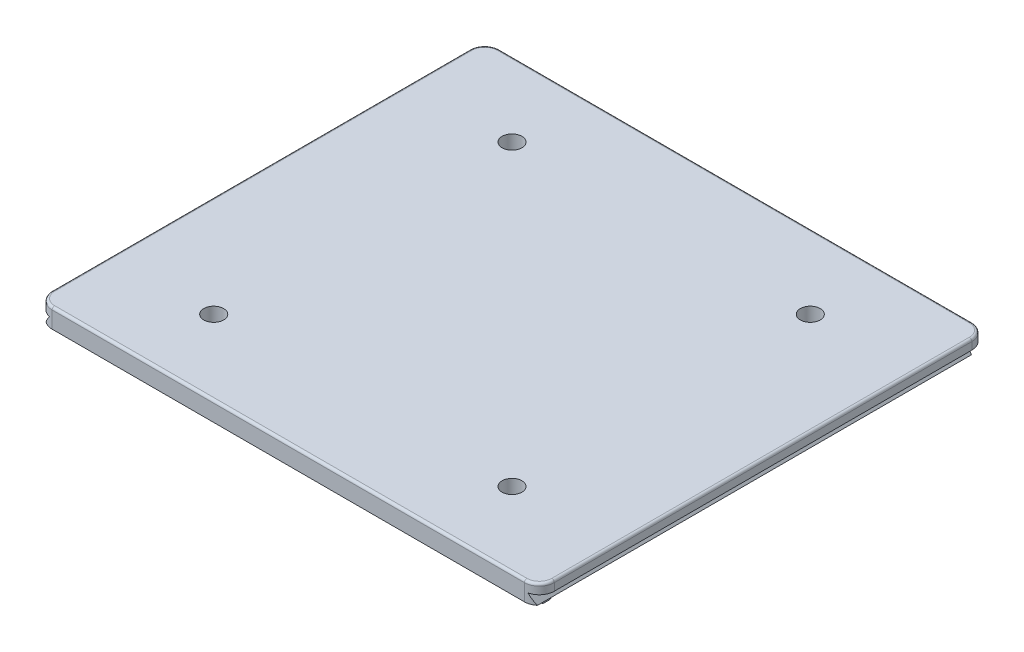
ISO-10303-21;
HEADER;
FILE_DESCRIPTION(('STEP AP214'),'2;1');
FILE_NAME('part.step','',(''),(''),'','','');
FILE_SCHEMA(('AUTOMOTIVE_DESIGN { 1 0 10303 214 1 1 1 1 }'));
ENDSEC;
DATA;
#1=APPLICATION_CONTEXT('core data for automotive mechanical design processes');
#2=APPLICATION_PROTOCOL_DEFINITION('international standard','automotive_design',2000,#1);
#3=PRODUCT_CONTEXT('',#1,'mechanical');
#4=PRODUCT('Part','Part','',(#3));
#5=PRODUCT_RELATED_PRODUCT_CATEGORY('part','',(#4));
#6=PRODUCT_DEFINITION_FORMATION('','',#4);
#7=PRODUCT_DEFINITION_CONTEXT('part definition',#1,'design');
#8=PRODUCT_DEFINITION('design','',#6,#7);
#9=PRODUCT_DEFINITION_SHAPE('','',#8);
#10=(LENGTH_UNIT() NAMED_UNIT(*) SI_UNIT(.MILLI.,.METRE.));
#11=(NAMED_UNIT(*) PLANE_ANGLE_UNIT() SI_UNIT($,.RADIAN.));
#12=(NAMED_UNIT(*) SI_UNIT($,.STERADIAN.) SOLID_ANGLE_UNIT());
#13=UNCERTAINTY_MEASURE_WITH_UNIT(LENGTH_MEASURE(1.E-05),#10,'distance_accuracy_value','');
#14=(GEOMETRIC_REPRESENTATION_CONTEXT(3) GLOBAL_UNCERTAINTY_ASSIGNED_CONTEXT((#13)) GLOBAL_UNIT_ASSIGNED_CONTEXT((#10,
#11,#12)) REPRESENTATION_CONTEXT('',''));
#15=CARTESIAN_POINT('',(0.,0.,0.));
#16=DIRECTION('',(0.,0.,1.));
#17=DIRECTION('',(1.,0.,0.));
#18=AXIS2_PLACEMENT_3D('',#15,#16,#17);
#19=CARTESIAN_POINT('',(0.,24.25,-189.073352076598));
#20=DIRECTION('',(0.,1.,0.));
#21=DIRECTION('',(-1.,0.,0.));
#22=AXIS2_PLACEMENT_3D('',#19,#20,#21);
#23=PLANE('',#22);
#24=CARTESIAN_POINT('',(-60.,24.25,-75.));
#25=DIRECTION('',(0.,1.,0.));
#26=DIRECTION('',(-1.,0.,0.));
#27=AXIS2_PLACEMENT_3D('',#24,#25,#26);
#28=CIRCLE('',#27,2.);
#29=CARTESIAN_POINT('',(-62.,24.25,-75.));
#30=VERTEX_POINT('',#29);
#31=EDGE_CURVE('E355',#30,#30,#28,.F.);
#32=ORIENTED_EDGE('',*,*,#31,.F.);
#33=EDGE_LOOP('',(#32));
#34=FACE_BOUND('',#33,.T.);
#35=CARTESIAN_POINT('',(-60.,24.25,-15.));
#36=DIRECTION('',(0.,1.,0.));
#37=DIRECTION('',(-1.,0.,0.));
#38=AXIS2_PLACEMENT_3D('',#35,#36,#37);
#39=CIRCLE('',#38,2.);
#40=CARTESIAN_POINT('',(-62.,24.25,-15.));
#41=VERTEX_POINT('',#40);
#42=EDGE_CURVE('E366',#41,#41,#39,.F.);
#43=ORIENTED_EDGE('',*,*,#42,.F.);
#44=EDGE_LOOP('',(#43));
#45=FACE_BOUND('',#44,.T.);
#46=CARTESIAN_POINT('',(0.,24.25,-15.));
#47=DIRECTION('',(0.,1.,0.));
#48=DIRECTION('',(-1.,0.,0.));
#49=AXIS2_PLACEMENT_3D('',#46,#47,#48);
#50=CIRCLE('',#49,2.);
#51=CARTESIAN_POINT('',(-2.,24.25,-15.));
#52=VERTEX_POINT('',#51);
#53=EDGE_CURVE('E879',#52,#52,#50,.F.);
#54=ORIENTED_EDGE('',*,*,#53,.F.);
#55=EDGE_LOOP('',(#54));
#56=FACE_BOUND('',#55,.T.);
#57=CARTESIAN_POINT('',(0.,24.25,-75.));
#58=DIRECTION('',(0.,1.,0.));
#59=DIRECTION('',(-1.,0.,0.));
#60=AXIS2_PLACEMENT_3D('',#57,#58,#59);
#61=CIRCLE('',#60,2.);
#62=CARTESIAN_POINT('',(-2.,24.25,-75.));
#63=VERTEX_POINT('',#62);
#64=EDGE_CURVE('E223',#63,#63,#61,.F.);
#65=ORIENTED_EDGE('',*,*,#64,.F.);
#66=EDGE_LOOP('',(#65));
#67=FACE_BOUND('',#66,.T.);
#68=DIRECTION('',(1.,0.,0.));
#69=VECTOR('',#68,1.);
#70=CARTESIAN_POINT('',(19.4201695446766,24.25,-3.49999999999999));
#71=LINE('',#70,#69);
#72=CARTESIAN_POINT('',(-79.4201695446767,24.25,-3.49999999999998));
#73=VERTEX_POINT('',#72);
#74=CARTESIAN_POINT('',(19.4201695446766,24.25,-3.49999999999998));
#75=VERTEX_POINT('',#74);
#76=EDGE_CURVE('E205',#73,#75,#71,.T.);
#77=ORIENTED_EDGE('',*,*,#76,.F.);
#78=DIRECTION('',(0.,0.,1.));
#79=VECTOR('',#78,1.);
#80=CARTESIAN_POINT('',(-79.4201695446767,24.25,-189.073352076598));
#81=LINE('',#80,#79);
#82=CARTESIAN_POINT('',(-79.4201695446767,24.25,-88.));
#83=VERTEX_POINT('',#82);
#84=EDGE_CURVE('E204',#83,#73,#81,.T.);
#85=ORIENTED_EDGE('',*,*,#84,.F.);
#86=DIRECTION('',(1.,0.,0.));
#87=VECTOR('',#86,1.);
#88=CARTESIAN_POINT('',(0.,24.25,-88.));
#89=LINE('',#88,#87);
#90=CARTESIAN_POINT('',(19.4201695446766,24.25,-88.));
#91=VERTEX_POINT('',#90);
#92=EDGE_CURVE('E241',#83,#91,#89,.T.);
#93=ORIENTED_EDGE('',*,*,#92,.T.);
#94=DIRECTION('',(0.,0.,1.));
#95=VECTOR('',#94,1.);
#96=CARTESIAN_POINT('',(19.4201695446766,24.25,-189.073352076598));
#97=LINE('',#96,#95);
#98=EDGE_CURVE('E254',#91,#75,#97,.T.);
#99=ORIENTED_EDGE('',*,*,#98,.T.);
#100=EDGE_LOOP('',(#77,#85,#93,#99));
#101=FACE_BOUND('',#100,.T.);
#102=ADVANCED_FACE('F43',(#34,#45,#56,#67,#101),#23,.F.);
#103=CARTESIAN_POINT('',(19.4201695446766,24.25,-1.49999999999997));
#104=VERTEX_POINT('',#103);
#105=CARTESIAN_POINT('',(19.4201695446766,24.25,-0.695016503378748));
#106=VERTEX_POINT('',#105);
#107=EDGE_CURVE('E256',#104,#106,#97,.T.);
#108=ORIENTED_EDGE('',*,*,#107,.T.);
#109=CARTESIAN_POINT('',(17.5,24.25,-3.));
#110=DIRECTION('',(0.,1.,0.));
#111=DIRECTION('',(-1.,0.,0.));
#112=AXIS2_PLACEMENT_3D('',#109,#110,#111);
#113=CIRCLE('',#112,3.);
#114=CARTESIAN_POINT('',(17.5,24.25,0.));
#115=VERTEX_POINT('',#114);
#116=EDGE_CURVE('E289',#106,#115,#113,.F.);
#117=ORIENTED_EDGE('',*,*,#116,.T.);
#118=DIRECTION('',(-1.,0.,0.));
#119=VECTOR('',#118,1.);
#120=CARTESIAN_POINT('',(0.,24.25,0.));
#121=LINE('',#120,#119);
#122=CARTESIAN_POINT('',(-77.5,24.25,0.));
#123=VERTEX_POINT('',#122);
#124=EDGE_CURVE('E238',#115,#123,#121,.T.);
#125=ORIENTED_EDGE('',*,*,#124,.T.);
#126=CARTESIAN_POINT('',(-77.5,24.25,-3.));
#127=DIRECTION('',(0.,1.,0.));
#128=DIRECTION('',(-1.,0.,0.));
#129=AXIS2_PLACEMENT_3D('',#126,#127,#128);
#130=CIRCLE('',#129,3.);
#131=CARTESIAN_POINT('',(-79.4201695446767,24.25,-0.695016503378748));
#132=VERTEX_POINT('',#131);
#133=EDGE_CURVE('E214',#123,#132,#130,.F.);
#134=ORIENTED_EDGE('',*,*,#133,.T.);
#135=CARTESIAN_POINT('',(-79.4201695446767,24.25,-1.49999999999998));
#136=VERTEX_POINT('',#135);
#137=EDGE_CURVE('E200',#136,#132,#81,.T.);
#138=ORIENTED_EDGE('',*,*,#137,.F.);
#139=DIRECTION('',(-1.,0.,0.));
#140=VECTOR('',#139,1.);
#141=CARTESIAN_POINT('',(19.4201695446766,24.25,-1.49999999999998));
#142=LINE('',#141,#140);
#143=EDGE_CURVE('E206',#104,#136,#142,.T.);
#144=ORIENTED_EDGE('',*,*,#143,.F.);
#145=EDGE_LOOP('',(#108,#117,#125,#134,#138,#144));
#146=FACE_BOUND('',#145,.T.);
#147=ADVANCED_FACE('F210',(#146),#23,.F.);
#148=CARTESIAN_POINT('',(18.5,26.,-88.));
#149=DIRECTION('',(0.,0.,1.));
#150=DIRECTION('',(1.,0.,0.));
#151=AXIS2_PLACEMENT_3D('',#148,#149,#150);
#152=PLANE('',#151);
#153=DIRECTION('',(-1.,0.,0.));
#154=VECTOR('',#153,1.);
#155=CARTESIAN_POINT('',(-80.5,26.1,-88.));
#156=LINE('',#155,#154);
#157=CARTESIAN_POINT('',(18.1247855989887,26.1,-88.));
#158=VERTEX_POINT('',#157);
#159=CARTESIAN_POINT('',(-78.1247855989887,26.1,-88.));
#160=VERTEX_POINT('',#159);
#161=EDGE_CURVE('E230',#158,#160,#156,.T.);
#162=ORIENTED_EDGE('',*,*,#161,.F.);
#163=DIRECTION('',(-0.573576436351041,0.819152044288995,0.));
#164=VECTOR('',#163,1.);
#165=CARTESIAN_POINT('',(24.4249023849071,17.102500769948,-88.));
#166=LINE('',#165,#164);
#167=EDGE_CURVE('E234',#91,#158,#166,.T.);
#168=ORIENTED_EDGE('',*,*,#167,.F.);
#169=ORIENTED_EDGE('',*,*,#92,.F.);
#170=DIRECTION('',(-0.57357643635105,-0.819152044288989,0.));
#171=VECTOR('',#170,1.);
#172=CARTESIAN_POINT('',(-64.6855066846768,45.2932793935257,-88.));
#173=LINE('',#172,#171);
#174=EDGE_CURVE('E239',#160,#83,#173,.T.);
#175=ORIENTED_EDGE('',*,*,#174,.F.);
#176=EDGE_LOOP('',(#162,#168,#169,#175));
#177=FACE_BOUND('',#176,.T.);
#178=ADVANCED_FACE('F393',(#177),#152,.F.);
#179=CARTESIAN_POINT('',(20.5,0.,-189.073352076598));
#180=DIRECTION('',(1.,0.,0.));
#181=DIRECTION('',(0.,0.,-1.));
#182=AXIS2_PLACEMENT_3D('',#179,#180,#181);
#183=PLANE('',#182);
#184=DIRECTION('',(0.,1.,0.));
#185=VECTOR('',#184,1.);
#186=CARTESIAN_POINT('',(20.5,28.1,-87.));
#187=LINE('',#186,#185);
#188=CARTESIAN_POINT('',(20.5,26.1,-87.));
#189=VERTEX_POINT('',#188);
#190=CARTESIAN_POINT('',(20.5,27.6,-87.));
#191=VERTEX_POINT('',#190);
#192=EDGE_CURVE('E273',#189,#191,#187,.T.);
#193=ORIENTED_EDGE('',*,*,#192,.T.);
#194=DIRECTION('',(0.,0.,1.));
#195=VECTOR('',#194,1.);
#196=CARTESIAN_POINT('',(20.5,27.6,-189.073352076598));
#197=LINE('',#196,#195);
#198=CARTESIAN_POINT('',(20.5,27.6,-3.));
#199=VERTEX_POINT('',#198);
#200=EDGE_CURVE('E322',#191,#199,#197,.T.);
#201=ORIENTED_EDGE('',*,*,#200,.T.);
#202=DIRECTION('',(0.,1.,0.));
#203=VECTOR('',#202,1.);
#204=CARTESIAN_POINT('',(20.5,0.,-3.));
#205=LINE('',#204,#203);
#206=CARTESIAN_POINT('',(20.5,26.1,-3.));
#207=VERTEX_POINT('',#206);
#208=EDGE_CURVE('E276',#199,#207,#205,.F.);
#209=ORIENTED_EDGE('',*,*,#208,.T.);
#210=DIRECTION('',(0.,0.,1.));
#211=VECTOR('',#210,1.);
#212=CARTESIAN_POINT('',(20.5,26.1,-189.073352076598));
#213=LINE('',#212,#211);
#214=EDGE_CURVE('E242',#189,#207,#213,.T.);
#215=ORIENTED_EDGE('',*,*,#214,.F.);
#216=EDGE_LOOP('',(#193,#201,#209,#215));
#217=FACE_BOUND('',#216,.T.);
#218=ADVANCED_FACE('F447',(#217),#183,.T.);
#219=CARTESIAN_POINT('',(0.,26.1,-189.073352076598));
#220=DIRECTION('',(0.,-1.,0.));
#221=DIRECTION('',(0.,0.,-1.));
#222=AXIS2_PLACEMENT_3D('',#219,#220,#221);
#223=PLANE('',#222);
#224=ORIENTED_EDGE('',*,*,#214,.T.);
#225=CARTESIAN_POINT('',(17.5,26.1,-3.));
#226=DIRECTION('',(0.,-1.,0.));
#227=DIRECTION('',(0.,0.,-1.));
#228=AXIS2_PLACEMENT_3D('',#225,#226,#227);
#229=CIRCLE('',#228,3.);
#230=CARTESIAN_POINT('',(18.1247855989887,26.1,-0.0657806906612657));
#231=VERTEX_POINT('',#230);
#232=EDGE_CURVE('E284',#207,#231,#229,.T.);
#233=ORIENTED_EDGE('',*,*,#232,.T.);
#234=DIRECTION('',(0.,0.,1.));
#235=VECTOR('',#234,1.);
#236=CARTESIAN_POINT('',(18.1247855989887,26.1,-189.073352076598));
#237=LINE('',#236,#235);
#238=EDGE_CURVE('E251',#158,#231,#237,.T.);
#239=ORIENTED_EDGE('',*,*,#238,.F.);
#240=ORIENTED_EDGE('',*,*,#161,.T.);
#241=DIRECTION('',(0.,0.,1.));
#242=VECTOR('',#241,1.);
#243=CARTESIAN_POINT('',(-78.1247855989887,26.1,-189.073352076598));
#244=LINE('',#243,#242);
#245=CARTESIAN_POINT('',(-78.1247855989887,26.1,-0.0657806906612522));
#246=VERTEX_POINT('',#245);
#247=EDGE_CURVE('E215',#160,#246,#244,.T.);
#248=ORIENTED_EDGE('',*,*,#247,.T.);
#249=CARTESIAN_POINT('',(-77.5,26.1,-3.));
#250=DIRECTION('',(0.,-1.,0.));
#251=DIRECTION('',(0.,0.,-1.));
#252=AXIS2_PLACEMENT_3D('',#249,#250,#251);
#253=CIRCLE('',#252,3.);
#254=CARTESIAN_POINT('',(-80.5,26.1,-3.));
#255=VERTEX_POINT('',#254);
#256=EDGE_CURVE('E282',#246,#255,#253,.T.);
#257=ORIENTED_EDGE('',*,*,#256,.T.);
#258=DIRECTION('',(0.,0.,1.));
#259=VECTOR('',#258,1.);
#260=CARTESIAN_POINT('',(-80.5,26.1,-189.073352076598));
#261=LINE('',#260,#259);
#262=CARTESIAN_POINT('',(-80.5,26.1,-87.));
#263=VERTEX_POINT('',#262);
#264=EDGE_CURVE('E248',#263,#255,#261,.T.);
#265=ORIENTED_EDGE('',*,*,#264,.F.);
#266=CARTESIAN_POINT('',(-77.5,26.1,-87.));
#267=DIRECTION('',(0.,-1.,0.));
#268=DIRECTION('',(0.,0.,-1.));
#269=AXIS2_PLACEMENT_3D('',#266,#267,#268);
#270=CIRCLE('',#269,3.);
#271=CARTESIAN_POINT('',(-77.5,26.1,-90.));
#272=VERTEX_POINT('',#271);
#273=EDGE_CURVE('E278',#263,#272,#270,.T.);
#274=ORIENTED_EDGE('',*,*,#273,.T.);
#275=DIRECTION('',(1.,0.,0.));
#276=VECTOR('',#275,1.);
#277=CARTESIAN_POINT('',(-80.5,26.1,-90.));
#278=LINE('',#277,#276);
#279=CARTESIAN_POINT('',(17.5,26.1,-90.));
#280=VERTEX_POINT('',#279);
#281=EDGE_CURVE('E235',#272,#280,#278,.T.);
#282=ORIENTED_EDGE('',*,*,#281,.T.);
#283=CARTESIAN_POINT('',(17.5,26.1,-87.));
#284=DIRECTION('',(0.,-1.,0.));
#285=DIRECTION('',(0.,0.,-1.));
#286=AXIS2_PLACEMENT_3D('',#283,#284,#285);
#287=CIRCLE('',#286,3.);
#288=EDGE_CURVE('E280',#280,#189,#287,.T.);
#289=ORIENTED_EDGE('',*,*,#288,.T.);
#290=EDGE_LOOP('',(#224,#233,#239,#240,#248,#257,#265,#274,#282,#289));
#291=FACE_BOUND('',#290,.T.);
#292=ADVANCED_FACE('F398',(#291),#223,.T.);
#293=CARTESIAN_POINT('',(24.4249023849071,17.102500769948,-189.073352076598));
#294=DIRECTION('',(-0.819152044288995,-0.573576436351041,0.));
#295=DIRECTION('',(0.573576436351041,-0.819152044288995,0.));
#296=AXIS2_PLACEMENT_3D('',#293,#294,#295);
#297=PLANE('',#296);
#298=ORIENTED_EDGE('',*,*,#238,.T.);
#299=CARTESIAN_POINT('',(17.5,26.9922863078369,-3.));
#300=DIRECTION('',(-0.819152044288995,-0.573576436351041,0.));
#301=DIRECTION('',(-0.573576436351041,0.819152044288995,0.));
#302=AXIS2_PLACEMENT_3D('',#299,#300,#301);
#303=ELLIPSE('',#302,5.23034038686334,3.);
#304=EDGE_CURVE('E286',#231,#106,#303,.F.);
#305=ORIENTED_EDGE('',*,*,#304,.T.);
#306=ORIENTED_EDGE('',*,*,#107,.F.);
#307=DIRECTION('',(0.,0.,1.));
#308=VECTOR('',#307,1.);
#309=CARTESIAN_POINT('',(19.4201695446766,24.25,-1.49999999999998));
#310=LINE('',#309,#308);
#311=EDGE_CURVE('E220',#75,#104,#310,.T.);
#312=ORIENTED_EDGE('',*,*,#311,.F.);
#313=ORIENTED_EDGE('',*,*,#98,.F.);
#314=ORIENTED_EDGE('',*,*,#167,.T.);
#315=EDGE_LOOP('',(#298,#305,#306,#312,#313,#314));
#316=FACE_BOUND('',#315,.T.);
#317=ADVANCED_FACE('F390',(#316),#297,.F.);
#318=CARTESIAN_POINT('',(-64.6855066846768,45.2932793935257,-189.073352076598));
#319=DIRECTION('',(0.819152044288989,-0.57357643635105,0.));
#320=DIRECTION('',(0.57357643635105,0.819152044288989,0.));
#321=AXIS2_PLACEMENT_3D('',#318,#319,#320);
#322=PLANE('',#321);
#323=ORIENTED_EDGE('',*,*,#137,.T.);
#324=CARTESIAN_POINT('',(-77.5,26.9922863078368,-3.));
#325=DIRECTION('',(0.819152044288989,-0.57357643635105,0.));
#326=DIRECTION('',(-0.57357643635105,-0.819152044288989,0.));
#327=AXIS2_PLACEMENT_3D('',#324,#325,#326);
#328=ELLIPSE('',#327,5.23034038686331,3.);
#329=EDGE_CURVE('E295',#132,#246,#328,.F.);
#330=ORIENTED_EDGE('',*,*,#329,.T.);
#331=ORIENTED_EDGE('',*,*,#247,.F.);
#332=ORIENTED_EDGE('',*,*,#174,.T.);
#333=ORIENTED_EDGE('',*,*,#84,.T.);
#334=DIRECTION('',(0.,0.,-1.));
#335=VECTOR('',#334,1.);
#336=CARTESIAN_POINT('',(-79.4201695446767,24.25,-3.49999999999998));
#337=LINE('',#336,#335);
#338=EDGE_CURVE('E184',#136,#73,#337,.T.);
#339=ORIENTED_EDGE('',*,*,#338,.F.);
#340=EDGE_LOOP('',(#323,#330,#331,#332,#333,#339));
#341=FACE_BOUND('',#340,.T.);
#342=ADVANCED_FACE('F199',(#341),#322,.F.);
#343=CARTESIAN_POINT('',(-80.5000000000002,5.58580959264534E-13,-189.073352076598));
#344=DIRECTION('',(1.,0.,0.));
#345=DIRECTION('',(0.,1.,0.));
#346=AXIS2_PLACEMENT_3D('',#343,#344,#345);
#347=PLANE('',#346);
#348=DIRECTION('',(0.,1.,0.));
#349=VECTOR('',#348,1.);
#350=CARTESIAN_POINT('',(-80.5,28.1,-3.));
#351=LINE('',#350,#349);
#352=CARTESIAN_POINT('',(-80.5,27.6,-3.));
#353=VERTEX_POINT('',#352);
#354=EDGE_CURVE('E293',#255,#353,#351,.T.);
#355=ORIENTED_EDGE('',*,*,#354,.T.);
#356=DIRECTION('',(0.,0.,1.));
#357=VECTOR('',#356,1.);
#358=CARTESIAN_POINT('',(-80.5,27.6,-87.));
#359=LINE('',#358,#357);
#360=CARTESIAN_POINT('',(-80.5,27.6,-87.));
#361=VERTEX_POINT('',#360);
#362=EDGE_CURVE('E330',#353,#361,#359,.F.);
#363=ORIENTED_EDGE('',*,*,#362,.T.);
#364=DIRECTION('',(0.,-1.,0.));
#365=VECTOR('',#364,1.);
#366=CARTESIAN_POINT('',(-80.5000000000002,5.58580959264534E-13,-87.));
#367=LINE('',#366,#365);
#368=EDGE_CURVE('E291',#361,#263,#367,.T.);
#369=ORIENTED_EDGE('',*,*,#368,.T.);
#370=ORIENTED_EDGE('',*,*,#264,.T.);
#371=EDGE_LOOP('',(#355,#363,#369,#370));
#372=FACE_BOUND('',#371,.T.);
#373=ADVANCED_FACE('F426',(#372),#347,.F.);
#374=CARTESIAN_POINT('',(0.,28.1,-189.073352076598));
#375=DIRECTION('',(0.,1.,0.));
#376=DIRECTION('',(-1.,0.,0.));
#377=AXIS2_PLACEMENT_3D('',#374,#375,#376);
#378=PLANE('',#377);
#379=DIRECTION('',(-1.,0.,0.));
#380=VECTOR('',#379,1.);
#381=CARTESIAN_POINT('',(0.,28.1,-0.5));
#382=LINE('',#381,#380);
#383=CARTESIAN_POINT('',(-77.5,28.1,-0.5));
#384=VERTEX_POINT('',#383);
#385=CARTESIAN_POINT('',(17.5,28.1,-0.5));
#386=VERTEX_POINT('',#385);
#387=EDGE_CURVE('E302',#384,#386,#382,.F.);
#388=ORIENTED_EDGE('',*,*,#387,.T.);
#389=CARTESIAN_POINT('',(17.5,28.1,-3.));
#390=DIRECTION('',(0.,1.,0.));
#391=DIRECTION('',(-1.,0.,0.));
#392=AXIS2_PLACEMENT_3D('',#389,#390,#391);
#393=CIRCLE('',#392,2.5);
#394=CARTESIAN_POINT('',(20.,28.1,-3.));
#395=VERTEX_POINT('',#394);
#396=EDGE_CURVE('E316',#386,#395,#393,.T.);
#397=ORIENTED_EDGE('',*,*,#396,.T.);
#398=DIRECTION('',(0.,0.,1.));
#399=VECTOR('',#398,1.);
#400=CARTESIAN_POINT('',(20.,28.1,-189.073352076598));
#401=LINE('',#400,#399);
#402=CARTESIAN_POINT('',(20.,28.1,-87.));
#403=VERTEX_POINT('',#402);
#404=EDGE_CURVE('E314',#395,#403,#401,.F.);
#405=ORIENTED_EDGE('',*,*,#404,.T.);
#406=CARTESIAN_POINT('',(17.5,28.1,-87.));
#407=DIRECTION('',(0.,1.,0.));
#408=DIRECTION('',(-1.,0.,0.));
#409=AXIS2_PLACEMENT_3D('',#406,#407,#408);
#410=CIRCLE('',#409,2.5);
#411=CARTESIAN_POINT('',(17.5,28.1,-89.5));
#412=VERTEX_POINT('',#411);
#413=EDGE_CURVE('E312',#403,#412,#410,.T.);
#414=ORIENTED_EDGE('',*,*,#413,.T.);
#415=DIRECTION('',(-1.,0.,0.));
#416=VECTOR('',#415,1.);
#417=CARTESIAN_POINT('',(-77.5,28.1,-89.5));
#418=LINE('',#417,#416);
#419=CARTESIAN_POINT('',(-77.5,28.1,-89.5));
#420=VERTEX_POINT('',#419);
#421=EDGE_CURVE('E310',#412,#420,#418,.T.);
#422=ORIENTED_EDGE('',*,*,#421,.T.);
#423=CARTESIAN_POINT('',(-77.5,28.1,-87.));
#424=DIRECTION('',(0.,1.,0.));
#425=DIRECTION('',(-1.,0.,0.));
#426=AXIS2_PLACEMENT_3D('',#423,#424,#425);
#427=CIRCLE('',#426,2.5);
#428=CARTESIAN_POINT('',(-80.,28.1,-87.));
#429=VERTEX_POINT('',#428);
#430=EDGE_CURVE('E308',#420,#429,#427,.T.);
#431=ORIENTED_EDGE('',*,*,#430,.T.);
#432=DIRECTION('',(0.,0.,1.));
#433=VECTOR('',#432,1.);
#434=CARTESIAN_POINT('',(-80.,28.1,-3.));
#435=LINE('',#434,#433);
#436=CARTESIAN_POINT('',(-80.,28.1,-3.));
#437=VERTEX_POINT('',#436);
#438=EDGE_CURVE('E306',#429,#437,#435,.T.);
#439=ORIENTED_EDGE('',*,*,#438,.T.);
#440=CARTESIAN_POINT('',(-77.5,28.1,-3.));
#441=DIRECTION('',(0.,1.,0.));
#442=DIRECTION('',(-1.,0.,0.));
#443=AXIS2_PLACEMENT_3D('',#440,#441,#442);
#444=CIRCLE('',#443,2.5);
#445=EDGE_CURVE('E304',#437,#384,#444,.T.);
#446=ORIENTED_EDGE('',*,*,#445,.T.);
#447=EDGE_LOOP('',(#388,#397,#405,#414,#422,#431,#439,#446));
#448=FACE_BOUND('',#447,.T.);
#449=CARTESIAN_POINT('',(-60.,28.1,-75.));
#450=DIRECTION('',(0.,1.,0.));
#451=DIRECTION('',(1.,0.,0.));
#452=AXIS2_PLACEMENT_3D('',#449,#450,#451);
#453=CIRCLE('',#452,2.);
#454=CARTESIAN_POINT('',(-58.,28.1,-75.));
#455=VERTEX_POINT('',#454);
#456=EDGE_CURVE('E361',#455,#455,#453,.T.);
#457=ORIENTED_EDGE('',*,*,#456,.F.);
#458=EDGE_LOOP('',(#457));
#459=FACE_BOUND('',#458,.T.);
#460=CARTESIAN_POINT('',(-60.,28.1,-15.));
#461=DIRECTION('',(0.,1.,0.));
#462=DIRECTION('',(-1.,0.,0.));
#463=AXIS2_PLACEMENT_3D('',#460,#461,#462);
#464=CIRCLE('',#463,2.);
#465=CARTESIAN_POINT('',(-62.,28.1,-15.));
#466=VERTEX_POINT('',#465);
#467=EDGE_CURVE('E369',#466,#466,#464,.T.);
#468=ORIENTED_EDGE('',*,*,#467,.F.);
#469=EDGE_LOOP('',(#468));
#470=FACE_BOUND('',#469,.T.);
#471=CARTESIAN_POINT('',(0.,28.1,-15.));
#472=DIRECTION('',(0.,1.,0.));
#473=DIRECTION('',(1.,0.,0.));
#474=AXIS2_PLACEMENT_3D('',#471,#472,#473);
#475=CIRCLE('',#474,2.);
#476=CARTESIAN_POINT('',(2.,28.1,-15.));
#477=VERTEX_POINT('',#476);
#478=EDGE_CURVE('E375',#477,#477,#475,.T.);
#479=ORIENTED_EDGE('',*,*,#478,.F.);
#480=EDGE_LOOP('',(#479));
#481=FACE_BOUND('',#480,.T.);
#482=CARTESIAN_POINT('',(0.,28.1,-75.));
#483=DIRECTION('',(0.,1.,0.));
#484=DIRECTION('',(-1.,0.,0.));
#485=AXIS2_PLACEMENT_3D('',#482,#483,#484);
#486=CIRCLE('',#485,2.);
#487=CARTESIAN_POINT('',(-2.,28.1,-75.));
#488=VERTEX_POINT('',#487);
#489=EDGE_CURVE('E372',#488,#488,#486,.T.);
#490=ORIENTED_EDGE('',*,*,#489,.F.);
#491=EDGE_LOOP('',(#490));
#492=FACE_BOUND('',#491,.T.);
#493=ADVANCED_FACE('F420',(#448,#459,#470,#481,#492),#378,.T.);
#494=CARTESIAN_POINT('',(0.,0.,0.));
#495=DIRECTION('',(0.,0.,1.));
#496=DIRECTION('',(1.,0.,0.));
#497=AXIS2_PLACEMENT_3D('',#494,#495,#496);
#498=PLANE('',#497);
#499=DIRECTION('',(0.,1.,0.));
#500=VECTOR('',#499,1.);
#501=CARTESIAN_POINT('',(17.5,0.,0.));
#502=LINE('',#501,#500);
#503=CARTESIAN_POINT('',(17.5,27.6,0.));
#504=VERTEX_POINT('',#503);
#505=EDGE_CURVE('E271',#115,#504,#502,.T.);
#506=ORIENTED_EDGE('',*,*,#505,.T.);
#507=DIRECTION('',(-1.,0.,0.));
#508=VECTOR('',#507,1.);
#509=CARTESIAN_POINT('',(0.,27.6,0.));
#510=LINE('',#509,#508);
#511=CARTESIAN_POINT('',(-77.5,27.6,0.));
#512=VERTEX_POINT('',#511);
#513=EDGE_CURVE('E11',#504,#512,#510,.T.);
#514=ORIENTED_EDGE('',*,*,#513,.T.);
#515=DIRECTION('',(0.,1.,0.));
#516=VECTOR('',#515,1.);
#517=CARTESIAN_POINT('',(-77.5,26.1,0.));
#518=LINE('',#517,#516);
#519=EDGE_CURVE('E269',#512,#123,#518,.F.);
#520=ORIENTED_EDGE('',*,*,#519,.T.);
#521=ORIENTED_EDGE('',*,*,#124,.F.);
#522=EDGE_LOOP('',(#506,#514,#520,#521));
#523=FACE_BOUND('',#522,.T.);
#524=ADVANCED_FACE('F407',(#523),#498,.T.);
#525=CARTESIAN_POINT('',(-20.5,2.,-90.));
#526=DIRECTION('',(0.,0.,1.));
#527=DIRECTION('',(1.,0.,0.));
#528=AXIS2_PLACEMENT_3D('',#525,#526,#527);
#529=PLANE('',#528);
#530=DIRECTION('',(0.,-1.,0.));
#531=VECTOR('',#530,1.);
#532=CARTESIAN_POINT('',(-77.5000000000002,2.0000000000004,-90.));
#533=LINE('',#532,#531);
#534=CARTESIAN_POINT('',(-77.5,27.6,-90.));
#535=VERTEX_POINT('',#534);
#536=EDGE_CURVE('E297',#272,#535,#533,.F.);
#537=ORIENTED_EDGE('',*,*,#536,.T.);
#538=DIRECTION('',(-1.,0.,0.));
#539=VECTOR('',#538,1.);
#540=CARTESIAN_POINT('',(17.5,27.6,-90.));
#541=LINE('',#540,#539);
#542=CARTESIAN_POINT('',(17.5,27.6,-90.));
#543=VERTEX_POINT('',#542);
#544=EDGE_CURVE('E326',#535,#543,#541,.F.);
#545=ORIENTED_EDGE('',*,*,#544,.T.);
#546=DIRECTION('',(0.,1.,0.));
#547=VECTOR('',#546,1.);
#548=CARTESIAN_POINT('',(17.5,26.1,-90.));
#549=LINE('',#548,#547);
#550=EDGE_CURVE('E300',#543,#280,#549,.F.);
#551=ORIENTED_EDGE('',*,*,#550,.T.);
#552=ORIENTED_EDGE('',*,*,#281,.F.);
#553=EDGE_LOOP('',(#537,#545,#551,#552));
#554=FACE_BOUND('',#553,.T.);
#555=ADVANCED_FACE('F439',(#554),#529,.F.);
#556=CARTESIAN_POINT('',(19.4201695446766,24.,-1.49999999999998));
#557=DIRECTION('',(-1.,0.,0.));
#558=DIRECTION('',(0.,0.,1.));
#559=AXIS2_PLACEMENT_3D('',#556,#557,#558);
#560=PLANE('',#559);
#561=DIRECTION('',(0.,0.,1.));
#562=VECTOR('',#561,1.);
#563=CARTESIAN_POINT('',(19.4201695446766,24.,-1.49999999999998));
#564=LINE('',#563,#562);
#565=CARTESIAN_POINT('',(19.4201695446766,24.,-3.06698729810777));
#566=VERTEX_POINT('',#565);
#567=CARTESIAN_POINT('',(19.4201695446766,24.,-1.9330127018922));
#568=VERTEX_POINT('',#567);
#569=EDGE_CURVE('E229',#566,#568,#564,.T.);
#570=ORIENTED_EDGE('',*,*,#569,.F.);
#571=CARTESIAN_POINT('',(19.4201695446766,24.5,-3.06698729810777));
#572=DIRECTION('',(-1.,0.,0.));
#573=DIRECTION('',(0.,0.,1.));
#574=AXIS2_PLACEMENT_3D('',#571,#572,#573);
#575=CIRCLE('',#574,0.5);
#576=EDGE_CURVE('E193',#566,#75,#575,.F.);
#577=ORIENTED_EDGE('',*,*,#576,.T.);
#578=ORIENTED_EDGE('',*,*,#311,.T.);
#579=CARTESIAN_POINT('',(19.4201695446766,24.5,-1.9330127018922));
#580=DIRECTION('',(-1.,0.,0.));
#581=DIRECTION('',(0.,0.,1.));
#582=AXIS2_PLACEMENT_3D('',#579,#580,#581);
#583=CIRCLE('',#582,0.5);
#584=EDGE_CURVE('E219',#104,#568,#583,.F.);
#585=ORIENTED_EDGE('',*,*,#584,.T.);
#586=EDGE_LOOP('',(#570,#577,#578,#585));
#587=FACE_BOUND('',#586,.T.);
#588=ADVANCED_FACE('F387',(#587),#560,.F.);
#589=CARTESIAN_POINT('',(-79.4201695446767,24.,-3.49999999999998));
#590=DIRECTION('',(1.,0.,0.));
#591=DIRECTION('',(0.,0.,-1.));
#592=AXIS2_PLACEMENT_3D('',#589,#590,#591);
#593=PLANE('',#592);
#594=ORIENTED_EDGE('',*,*,#338,.T.);
#595=CARTESIAN_POINT('',(-79.4201695446767,24.5,-3.06698729810776));
#596=DIRECTION('',(1.,0.,0.));
#597=DIRECTION('',(0.,0.,-1.));
#598=AXIS2_PLACEMENT_3D('',#595,#596,#597);
#599=CIRCLE('',#598,0.5);
#600=CARTESIAN_POINT('',(-79.4201695446767,24.,-3.06698729810776));
#601=VERTEX_POINT('',#600);
#602=EDGE_CURVE('E192',#73,#601,#599,.F.);
#603=ORIENTED_EDGE('',*,*,#602,.T.);
#604=DIRECTION('',(0.,0.,-1.));
#605=VECTOR('',#604,1.);
#606=CARTESIAN_POINT('',(-79.4201695446767,24.,-3.49999999999998));
#607=LINE('',#606,#605);
#608=CARTESIAN_POINT('',(-79.4201695446767,24.,-1.9330127018922));
#609=VERTEX_POINT('',#608);
#610=EDGE_CURVE('E187',#609,#601,#607,.T.);
#611=ORIENTED_EDGE('',*,*,#610,.F.);
#612=CARTESIAN_POINT('',(-79.4201695446767,24.5,-1.9330127018922));
#613=DIRECTION('',(1.,0.,0.));
#614=DIRECTION('',(0.,0.,-1.));
#615=AXIS2_PLACEMENT_3D('',#612,#613,#614);
#616=CIRCLE('',#615,0.5);
#617=EDGE_CURVE('E181',#609,#136,#616,.F.);
#618=ORIENTED_EDGE('',*,*,#617,.T.);
#619=EDGE_LOOP('',(#594,#603,#611,#618));
#620=FACE_BOUND('',#619,.T.);
#621=ADVANCED_FACE('F183',(#620),#593,.F.);
#622=CARTESIAN_POINT('',(0.,24.,0.));
#623=DIRECTION('',(0.,1.,0.));
#624=DIRECTION('',(0.,0.,1.));
#625=AXIS2_PLACEMENT_3D('',#622,#623,#624);
#626=PLANE('',#625);
#627=ORIENTED_EDGE('',*,*,#610,.T.);
#628=DIRECTION('',(-1.,0.,0.));
#629=VECTOR('',#628,1.);
#630=CARTESIAN_POINT('',(0.,24.,-3.06698729810777));
#631=LINE('',#630,#629);
#632=EDGE_CURVE('E263',#601,#566,#631,.F.);
#633=ORIENTED_EDGE('',*,*,#632,.T.);
#634=ORIENTED_EDGE('',*,*,#569,.T.);
#635=DIRECTION('',(1.,0.,0.));
#636=VECTOR('',#635,1.);
#637=CARTESIAN_POINT('',(0.,24.,-1.9330127018922));
#638=LINE('',#637,#636);
#639=EDGE_CURVE('E233',#568,#609,#638,.F.);
#640=ORIENTED_EDGE('',*,*,#639,.T.);
#641=EDGE_LOOP('',(#627,#633,#634,#640));
#642=FACE_BOUND('',#641,.T.);
#643=ADVANCED_FACE('F381',(#642),#626,.F.);
#644=CARTESIAN_POINT('',(19.4201695446766,24.5,-3.06698729810777));
#645=DIRECTION('',(-1.,0.,0.));
#646=DIRECTION('',(0.,-1.,0.));
#647=AXIS2_PLACEMENT_3D('',#644,#645,#646);
#648=CYLINDRICAL_SURFACE('',#647,0.5);
#649=ORIENTED_EDGE('',*,*,#602,.F.);
#650=ORIENTED_EDGE('',*,*,#76,.T.);
#651=ORIENTED_EDGE('',*,*,#576,.F.);
#652=ORIENTED_EDGE('',*,*,#632,.F.);
#653=EDGE_LOOP('',(#649,#650,#651,#652));
#654=FACE_BOUND('',#653,.T.);
#655=ADVANCED_FACE('F384',(#654),#648,.T.);
#656=CARTESIAN_POINT('',(19.4201695446766,24.5,-1.9330127018922));
#657=DIRECTION('',(1.,0.,0.));
#658=DIRECTION('',(0.,1.,0.));
#659=AXIS2_PLACEMENT_3D('',#656,#657,#658);
#660=CYLINDRICAL_SURFACE('',#659,0.5);
#661=ORIENTED_EDGE('',*,*,#584,.F.);
#662=ORIENTED_EDGE('',*,*,#143,.T.);
#663=ORIENTED_EDGE('',*,*,#617,.F.);
#664=ORIENTED_EDGE('',*,*,#639,.F.);
#665=EDGE_LOOP('',(#661,#662,#663,#664));
#666=FACE_BOUND('',#665,.T.);
#667=ADVANCED_FACE('F218',(#666),#660,.T.);
#668=CARTESIAN_POINT('',(17.5,0.,-3.));
#669=DIRECTION('',(0.,1.,0.));
#670=DIRECTION('',(0.,0.,1.));
#671=AXIS2_PLACEMENT_3D('',#668,#669,#670);
#672=CYLINDRICAL_SURFACE('',#671,3.);
#673=ORIENTED_EDGE('',*,*,#208,.F.);
#674=CARTESIAN_POINT('',(17.5,27.6,-3.));
#675=DIRECTION('',(0.,1.,0.));
#676=DIRECTION('',(-1.,0.,0.));
#677=AXIS2_PLACEMENT_3D('',#674,#675,#676);
#678=CIRCLE('',#677,3.);
#679=EDGE_CURVE('E319',#199,#504,#678,.F.);
#680=ORIENTED_EDGE('',*,*,#679,.T.);
#681=ORIENTED_EDGE('',*,*,#505,.F.);
#682=ORIENTED_EDGE('',*,*,#116,.F.);
#683=ORIENTED_EDGE('',*,*,#304,.F.);
#684=ORIENTED_EDGE('',*,*,#232,.F.);
#685=EDGE_LOOP('',(#673,#680,#681,#682,#683,#684));
#686=FACE_BOUND('',#685,.T.);
#687=ADVANCED_FACE('F404',(#686),#672,.T.);
#688=CARTESIAN_POINT('',(-77.5000000000002,5.37764277552812E-13,-3.));
#689=DIRECTION('',(0.,-1.,0.));
#690=DIRECTION('',(1.,0.,0.));
#691=AXIS2_PLACEMENT_3D('',#688,#689,#690);
#692=CYLINDRICAL_SURFACE('',#691,3.);
#693=ORIENTED_EDGE('',*,*,#519,.F.);
#694=CARTESIAN_POINT('',(-77.5,27.6,-3.));
#695=DIRECTION('',(0.,1.,0.));
#696=DIRECTION('',(-1.,0.,0.));
#697=AXIS2_PLACEMENT_3D('',#694,#695,#696);
#698=CIRCLE('',#697,3.);
#699=EDGE_CURVE('E52',#512,#353,#698,.F.);
#700=ORIENTED_EDGE('',*,*,#699,.T.);
#701=ORIENTED_EDGE('',*,*,#354,.F.);
#702=ORIENTED_EDGE('',*,*,#256,.F.);
#703=ORIENTED_EDGE('',*,*,#329,.F.);
#704=ORIENTED_EDGE('',*,*,#133,.F.);
#705=EDGE_LOOP('',(#693,#700,#701,#702,#703,#704));
#706=FACE_BOUND('',#705,.T.);
#707=ADVANCED_FACE('F408',(#706),#692,.T.);
#708=CARTESIAN_POINT('',(17.5,0.,-87.));
#709=DIRECTION('',(0.,-1.,0.));
#710=DIRECTION('',(0.,0.,-1.));
#711=AXIS2_PLACEMENT_3D('',#708,#709,#710);
#712=CYLINDRICAL_SURFACE('',#711,3.);
#713=ORIENTED_EDGE('',*,*,#550,.F.);
#714=CARTESIAN_POINT('',(17.5,27.6,-87.));
#715=DIRECTION('',(0.,1.,0.));
#716=DIRECTION('',(-1.,0.,0.));
#717=AXIS2_PLACEMENT_3D('',#714,#715,#716);
#718=CIRCLE('',#717,3.);
#719=EDGE_CURVE('E324',#543,#191,#718,.F.);
#720=ORIENTED_EDGE('',*,*,#719,.T.);
#721=ORIENTED_EDGE('',*,*,#192,.F.);
#722=ORIENTED_EDGE('',*,*,#288,.F.);
#723=EDGE_LOOP('',(#713,#720,#721,#722));
#724=FACE_BOUND('',#723,.T.);
#725=ADVANCED_FACE('F443',(#724),#712,.T.);
#726=CARTESIAN_POINT('',(-77.5000000000002,5.37764277552812E-13,-87.));
#727=DIRECTION('',(0.,-1.,0.));
#728=DIRECTION('',(1.,0.,0.));
#729=AXIS2_PLACEMENT_3D('',#726,#727,#728);
#730=CYLINDRICAL_SURFACE('',#729,3.);
#731=ORIENTED_EDGE('',*,*,#368,.F.);
#732=CARTESIAN_POINT('',(-77.5,27.6,-87.));
#733=DIRECTION('',(0.,1.,0.));
#734=DIRECTION('',(-1.,0.,0.));
#735=AXIS2_PLACEMENT_3D('',#732,#733,#734);
#736=CIRCLE('',#735,3.);
#737=EDGE_CURVE('E328',#361,#535,#736,.F.);
#738=ORIENTED_EDGE('',*,*,#737,.T.);
#739=ORIENTED_EDGE('',*,*,#536,.F.);
#740=ORIENTED_EDGE('',*,*,#273,.F.);
#741=EDGE_LOOP('',(#731,#738,#739,#740));
#742=FACE_BOUND('',#741,.T.);
#743=ADVANCED_FACE('F430',(#742),#730,.T.);
#744=CARTESIAN_POINT('',(0.,23.999,-75.));
#745=DIRECTION('',(0.,1.,0.));
#746=DIRECTION('',(-1.,0.,0.));
#747=AXIS2_PLACEMENT_3D('',#744,#745,#746);
#748=CYLINDRICAL_SURFACE('',#747,2.);
#749=ORIENTED_EDGE('',*,*,#489,.T.);
#750=EDGE_LOOP('',(#749));
#751=FACE_BOUND('',#750,.T.);
#752=ORIENTED_EDGE('',*,*,#64,.T.);
#753=EDGE_LOOP('',(#752));
#754=FACE_BOUND('',#753,.T.);
#755=ADVANCED_FACE('F498',(#751,#754),#748,.F.);
#756=CARTESIAN_POINT('',(0.,23.999,-15.));
#757=DIRECTION('',(0.,1.,0.));
#758=DIRECTION('',(-1.,0.,0.));
#759=AXIS2_PLACEMENT_3D('',#756,#757,#758);
#760=CYLINDRICAL_SURFACE('',#759,2.);
#761=ORIENTED_EDGE('',*,*,#478,.T.);
#762=EDGE_LOOP('',(#761));
#763=FACE_BOUND('',#762,.T.);
#764=ORIENTED_EDGE('',*,*,#53,.T.);
#765=EDGE_LOOP('',(#764));
#766=FACE_BOUND('',#765,.T.);
#767=ADVANCED_FACE('F679',(#763,#766),#760,.F.);
#768=CARTESIAN_POINT('',(-60.,23.999,-15.));
#769=DIRECTION('',(0.,1.,0.));
#770=DIRECTION('',(-1.,0.,0.));
#771=AXIS2_PLACEMENT_3D('',#768,#769,#770);
#772=CYLINDRICAL_SURFACE('',#771,2.);
#773=ORIENTED_EDGE('',*,*,#467,.T.);
#774=EDGE_LOOP('',(#773));
#775=FACE_BOUND('',#774,.T.);
#776=ORIENTED_EDGE('',*,*,#42,.T.);
#777=EDGE_LOOP('',(#776));
#778=FACE_BOUND('',#777,.T.);
#779=ADVANCED_FACE('F667',(#775,#778),#772,.F.);
#780=CARTESIAN_POINT('',(-60.,23.999,-75.));
#781=DIRECTION('',(0.,1.,0.));
#782=DIRECTION('',(-1.,0.,0.));
#783=AXIS2_PLACEMENT_3D('',#780,#781,#782);
#784=CYLINDRICAL_SURFACE('',#783,2.);
#785=ORIENTED_EDGE('',*,*,#456,.T.);
#786=EDGE_LOOP('',(#785));
#787=FACE_BOUND('',#786,.T.);
#788=ORIENTED_EDGE('',*,*,#31,.T.);
#789=EDGE_LOOP('',(#788));
#790=FACE_BOUND('',#789,.T.);
#791=ADVANCED_FACE('F569',(#787,#790),#784,.F.);
#792=CARTESIAN_POINT('',(-77.5,27.6,-87.));
#793=DIRECTION('',(0.,1.,0.));
#794=DIRECTION('',(-1.,0.,0.));
#795=AXIS2_PLACEMENT_3D('',#792,#793,#794);
#796=TOROIDAL_SURFACE('',#795,2.5,0.5);
#797=CARTESIAN_POINT('',(-77.5,27.6,-89.5));
#798=DIRECTION('',(1.,0.,0.));
#799=DIRECTION('',(0.,0.,-1.));
#800=AXIS2_PLACEMENT_3D('',#797,#798,#799);
#801=CIRCLE('',#800,0.5);
#802=EDGE_CURVE('E348',#535,#420,#801,.T.);
#803=ORIENTED_EDGE('',*,*,#802,.F.);
#804=ORIENTED_EDGE('',*,*,#737,.F.);
#805=CARTESIAN_POINT('',(-80.,27.6,-87.));
#806=DIRECTION('',(0.,0.,1.));
#807=DIRECTION('',(1.,0.,0.));
#808=AXIS2_PLACEMENT_3D('',#805,#806,#807);
#809=CIRCLE('',#808,0.5);
#810=EDGE_CURVE('E47',#429,#361,#809,.T.);
#811=ORIENTED_EDGE('',*,*,#810,.F.);
#812=ORIENTED_EDGE('',*,*,#430,.F.);
#813=EDGE_LOOP('',(#803,#804,#811,#812));
#814=FACE_BOUND('',#813,.T.);
#815=ADVANCED_FACE('F45',(#814),#796,.T.);
#816=CARTESIAN_POINT('',(-80.,27.6,-189.073352076598));
#817=DIRECTION('',(0.,0.,-1.));
#818=DIRECTION('',(-1.,0.,0.));
#819=AXIS2_PLACEMENT_3D('',#816,#817,#818);
#820=CYLINDRICAL_SURFACE('',#819,0.5);
#821=ORIENTED_EDGE('',*,*,#810,.T.);
#822=ORIENTED_EDGE('',*,*,#362,.F.);
#823=CARTESIAN_POINT('',(-80.,27.6,-3.));
#824=DIRECTION('',(0.,0.,1.));
#825=DIRECTION('',(1.,0.,0.));
#826=AXIS2_PLACEMENT_3D('',#823,#824,#825);
#827=CIRCLE('',#826,0.5);
#828=EDGE_CURVE('E346',#437,#353,#827,.T.);
#829=ORIENTED_EDGE('',*,*,#828,.F.);
#830=ORIENTED_EDGE('',*,*,#438,.F.);
#831=EDGE_LOOP('',(#821,#822,#829,#830));
#832=FACE_BOUND('',#831,.T.);
#833=ADVANCED_FACE('F423',(#832),#820,.T.);
#834=CARTESIAN_POINT('',(0.,27.6,-89.5));
#835=DIRECTION('',(1.,0.,0.));
#836=DIRECTION('',(0.,1.,0.));
#837=AXIS2_PLACEMENT_3D('',#834,#835,#836);
#838=CYLINDRICAL_SURFACE('',#837,0.5);
#839=ORIENTED_EDGE('',*,*,#802,.T.);
#840=ORIENTED_EDGE('',*,*,#421,.F.);
#841=CARTESIAN_POINT('',(17.5,27.6,-89.5));
#842=DIRECTION('',(1.,0.,0.));
#843=DIRECTION('',(0.,0.,-1.));
#844=AXIS2_PLACEMENT_3D('',#841,#842,#843);
#845=CIRCLE('',#844,0.5);
#846=EDGE_CURVE('E343',#543,#412,#845,.T.);
#847=ORIENTED_EDGE('',*,*,#846,.F.);
#848=ORIENTED_EDGE('',*,*,#544,.F.);
#849=EDGE_LOOP('',(#839,#840,#847,#848));
#850=FACE_BOUND('',#849,.T.);
#851=ADVANCED_FACE('F435',(#850),#838,.T.);
#852=CARTESIAN_POINT('',(-77.5,27.6,-3.));
#853=DIRECTION('',(0.,1.,0.));
#854=DIRECTION('',(-1.,0.,0.));
#855=AXIS2_PLACEMENT_3D('',#852,#853,#854);
#856=TOROIDAL_SURFACE('',#855,2.5,0.5);
#857=ORIENTED_EDGE('',*,*,#828,.T.);
#858=ORIENTED_EDGE('',*,*,#699,.F.);
#859=CARTESIAN_POINT('',(-77.5,27.6,-0.500000000000003));
#860=DIRECTION('',(1.,0.,0.));
#861=DIRECTION('',(0.,0.,-1.));
#862=AXIS2_PLACEMENT_3D('',#859,#860,#861);
#863=CIRCLE('',#862,0.5);
#864=EDGE_CURVE('E340',#384,#512,#863,.T.);
#865=ORIENTED_EDGE('',*,*,#864,.F.);
#866=ORIENTED_EDGE('',*,*,#445,.F.);
#867=EDGE_LOOP('',(#857,#858,#865,#866));
#868=FACE_BOUND('',#867,.T.);
#869=ADVANCED_FACE('F411',(#868),#856,.T.);
#870=CARTESIAN_POINT('',(17.5,27.6,-87.));
#871=DIRECTION('',(0.,1.,0.));
#872=DIRECTION('',(-1.,0.,0.));
#873=AXIS2_PLACEMENT_3D('',#870,#871,#872);
#874=TOROIDAL_SURFACE('',#873,2.5,0.5);
#875=ORIENTED_EDGE('',*,*,#846,.T.);
#876=ORIENTED_EDGE('',*,*,#413,.F.);
#877=CARTESIAN_POINT('',(20.,27.6,-87.));
#878=DIRECTION('',(0.,0.,1.));
#879=DIRECTION('',(1.,0.,0.));
#880=AXIS2_PLACEMENT_3D('',#877,#878,#879);
#881=CIRCLE('',#880,0.5);
#882=EDGE_CURVE('E337',#191,#403,#881,.T.);
#883=ORIENTED_EDGE('',*,*,#882,.F.);
#884=ORIENTED_EDGE('',*,*,#719,.F.);
#885=EDGE_LOOP('',(#875,#876,#883,#884));
#886=FACE_BOUND('',#885,.T.);
#887=ADVANCED_FACE('F459',(#886),#874,.T.);
#888=CARTESIAN_POINT('',(0.,27.6,-0.5));
#889=DIRECTION('',(-1.,0.,0.));
#890=DIRECTION('',(0.,-1.,0.));
#891=AXIS2_PLACEMENT_3D('',#888,#889,#890);
#892=CYLINDRICAL_SURFACE('',#891,0.5);
#893=ORIENTED_EDGE('',*,*,#864,.T.);
#894=ORIENTED_EDGE('',*,*,#513,.F.);
#895=CARTESIAN_POINT('',(17.5,27.6,-0.5));
#896=DIRECTION('',(1.,0.,0.));
#897=DIRECTION('',(0.,0.,-1.));
#898=AXIS2_PLACEMENT_3D('',#895,#896,#897);
#899=CIRCLE('',#898,0.5);
#900=EDGE_CURVE('E335',#386,#504,#899,.T.);
#901=ORIENTED_EDGE('',*,*,#900,.F.);
#902=ORIENTED_EDGE('',*,*,#387,.F.);
#903=EDGE_LOOP('',(#893,#894,#901,#902));
#904=FACE_BOUND('',#903,.T.);
#905=ADVANCED_FACE('F416',(#904),#892,.T.);
#906=CARTESIAN_POINT('',(20.,27.6,-189.073352076598));
#907=DIRECTION('',(0.,0.,1.));
#908=DIRECTION('',(1.,0.,0.));
#909=AXIS2_PLACEMENT_3D('',#906,#907,#908);
#910=CYLINDRICAL_SURFACE('',#909,0.5);
#911=ORIENTED_EDGE('',*,*,#882,.T.);
#912=ORIENTED_EDGE('',*,*,#404,.F.);
#913=CARTESIAN_POINT('',(20.,27.6,-3.));
#914=DIRECTION('',(0.,0.,1.));
#915=DIRECTION('',(0.,-1.,0.));
#916=AXIS2_PLACEMENT_3D('',#913,#914,#915);
#917=CIRCLE('',#916,0.5);
#918=EDGE_CURVE('E333',#199,#395,#917,.T.);
#919=ORIENTED_EDGE('',*,*,#918,.F.);
#920=ORIENTED_EDGE('',*,*,#200,.F.);
#921=EDGE_LOOP('',(#911,#912,#919,#920));
#922=FACE_BOUND('',#921,.T.);
#923=ADVANCED_FACE('F456',(#922),#910,.T.);
#924=CARTESIAN_POINT('',(17.5,27.6,-3.));
#925=DIRECTION('',(0.,1.,0.));
#926=DIRECTION('',(-1.,0.,0.));
#927=AXIS2_PLACEMENT_3D('',#924,#925,#926);
#928=TOROIDAL_SURFACE('',#927,2.5,0.5);
#929=ORIENTED_EDGE('',*,*,#900,.T.);
#930=ORIENTED_EDGE('',*,*,#679,.F.);
#931=ORIENTED_EDGE('',*,*,#918,.T.);
#932=ORIENTED_EDGE('',*,*,#396,.F.);
#933=EDGE_LOOP('',(#929,#930,#931,#932));
#934=FACE_BOUND('',#933,.T.);
#935=ADVANCED_FACE('F453',(#934),#928,.T.);
#936=CLOSED_SHELL('',(#102,#147,#178,#218,#292,#317,#342,#373,#493,#524,#555,#588,#621,#643,
#655,#667,#687,#707,#725,#743,#755,#767,#779,#791,#815,#833,#851,#869,#887,#905,#923,#935));
#937=MANIFOLD_SOLID_BREP('B2',#936);
#938=ADVANCED_BREP_SHAPE_REPRESENTATION('',(#18,#937),#14);
#939=SHAPE_DEFINITION_REPRESENTATION(#9,#938);
ENDSEC;
END-ISO-10303-21;
